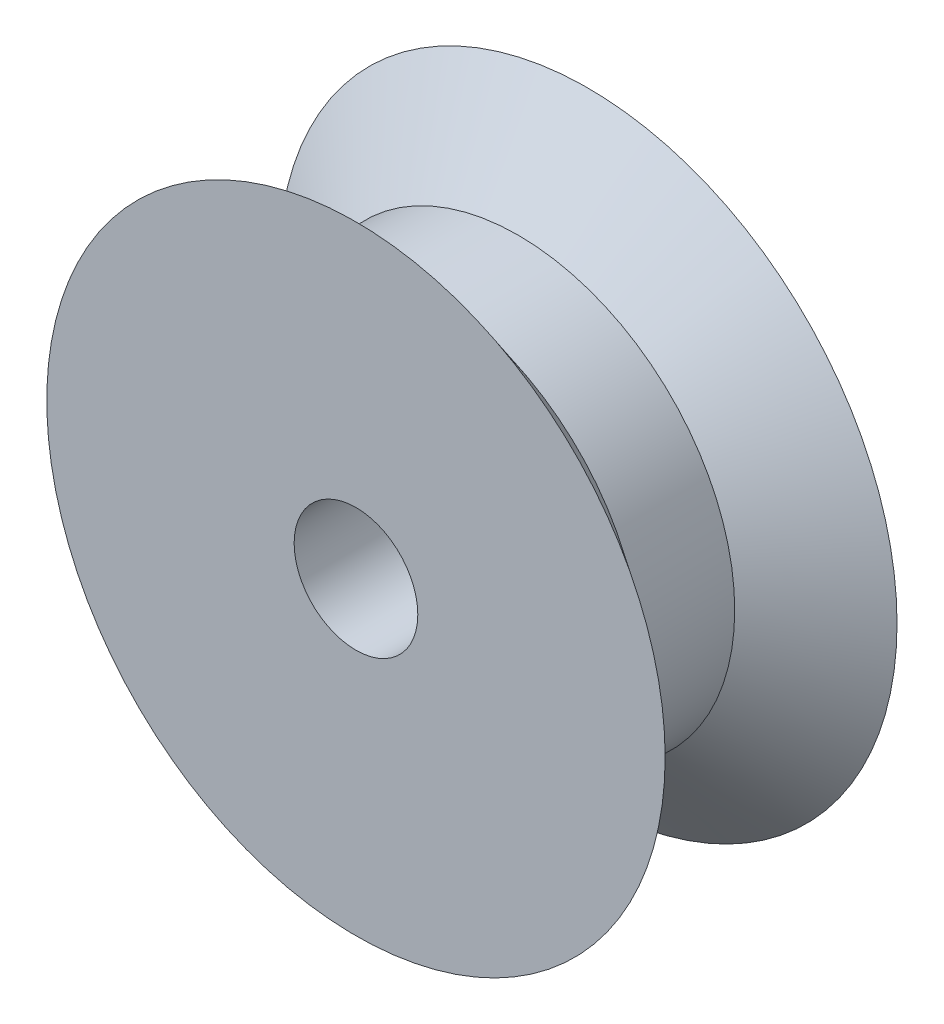
ISO-10303-21;
HEADER;
FILE_DESCRIPTION(('STEP AP214'),'2;1');
FILE_NAME('part.step','',(''),(''),'','','');
FILE_SCHEMA(('AUTOMOTIVE_DESIGN { 1 0 10303 214 1 1 1 1 }'));
ENDSEC;
DATA;
#1=APPLICATION_CONTEXT('core data for automotive mechanical design processes');
#2=APPLICATION_PROTOCOL_DEFINITION('international standard','automotive_design',2000,#1);
#3=PRODUCT_CONTEXT('',#1,'mechanical');
#4=PRODUCT('Part','Part','',(#3));
#5=PRODUCT_RELATED_PRODUCT_CATEGORY('part','',(#4));
#6=PRODUCT_DEFINITION_FORMATION('','',#4);
#7=PRODUCT_DEFINITION_CONTEXT('part definition',#1,'design');
#8=PRODUCT_DEFINITION('design','',#6,#7);
#9=PRODUCT_DEFINITION_SHAPE('','',#8);
#10=(LENGTH_UNIT() NAMED_UNIT(*) SI_UNIT(.MILLI.,.METRE.));
#11=(NAMED_UNIT(*) PLANE_ANGLE_UNIT() SI_UNIT($,.RADIAN.));
#12=(NAMED_UNIT(*) SI_UNIT($,.STERADIAN.) SOLID_ANGLE_UNIT());
#13=UNCERTAINTY_MEASURE_WITH_UNIT(LENGTH_MEASURE(1.E-05),#10,'distance_accuracy_value','');
#14=(GEOMETRIC_REPRESENTATION_CONTEXT(3) GLOBAL_UNCERTAINTY_ASSIGNED_CONTEXT((#13)) GLOBAL_UNIT_ASSIGNED_CONTEXT((#10,
#11,#12)) REPRESENTATION_CONTEXT('',''));
#15=CARTESIAN_POINT('',(0.,0.,0.));
#16=DIRECTION('',(0.,0.,1.));
#17=DIRECTION('',(1.,0.,0.));
#18=AXIS2_PLACEMENT_3D('',#15,#16,#17);
#19=CARTESIAN_POINT('',(0.,0.,0.));
#20=DIRECTION('',(0.,0.,1.));
#21=DIRECTION('',(1.,0.,0.));
#22=AXIS2_PLACEMENT_3D('',#19,#20,#21);
#23=PLANE('',#22);
#24=CARTESIAN_POINT('',(0.,0.,0.));
#25=DIRECTION('',(0.,0.,1.));
#26=DIRECTION('',(1.,0.,0.));
#27=AXIS2_PLACEMENT_3D('',#24,#25,#26);
#28=CIRCLE('',#27,25.4);
#29=CARTESIAN_POINT('',(25.4,0.,0.));
#30=VERTEX_POINT('',#29);
#31=EDGE_CURVE('E52',#30,#30,#28,.T.);
#32=ORIENTED_EDGE('',*,*,#31,.F.);
#33=EDGE_LOOP('',(#32));
#34=FACE_BOUND('',#33,.T.);
#35=CARTESIAN_POINT('',(0.,0.,0.));
#36=DIRECTION('',(0.,0.,1.));
#37=DIRECTION('',(1.,0.,0.));
#38=AXIS2_PLACEMENT_3D('',#35,#36,#37);
#39=CIRCLE('',#38,12.7);
#40=CARTESIAN_POINT('',(12.7,0.,0.));
#41=VERTEX_POINT('',#40);
#42=EDGE_CURVE('E10',#41,#41,#39,.F.);
#43=ORIENTED_EDGE('',*,*,#42,.F.);
#44=EDGE_LOOP('',(#43));
#45=FACE_BOUND('',#44,.T.);
#46=ADVANCED_FACE('F30',(#34,#45),#23,.F.);
#47=CARTESIAN_POINT('',(0.,0.,19.05));
#48=DIRECTION('',(0.,0.,1.));
#49=DIRECTION('',(1.,0.,0.));
#50=AXIS2_PLACEMENT_3D('',#47,#48,#49);
#51=PLANE('',#50);
#52=CARTESIAN_POINT('',(0.,0.,19.05));
#53=DIRECTION('',(0.,0.,1.));
#54=DIRECTION('',(1.,0.,0.));
#55=AXIS2_PLACEMENT_3D('',#52,#53,#54);
#56=CIRCLE('',#55,25.4);
#57=CARTESIAN_POINT('',(25.4,0.,19.05));
#58=VERTEX_POINT('',#57);
#59=EDGE_CURVE('E40',#58,#58,#56,.T.);
#60=ORIENTED_EDGE('',*,*,#59,.T.);
#61=EDGE_LOOP('',(#60));
#62=FACE_BOUND('',#61,.T.);
#63=CARTESIAN_POINT('',(0.,0.,19.05));
#64=DIRECTION('',(0.,0.,1.));
#65=DIRECTION('',(1.,0.,0.));
#66=AXIS2_PLACEMENT_3D('',#63,#64,#65);
#67=CIRCLE('',#66,5.08);
#68=CARTESIAN_POINT('',(5.08,0.,19.05));
#69=VERTEX_POINT('',#68);
#70=EDGE_CURVE('E36',#69,#69,#67,.T.);
#71=ORIENTED_EDGE('',*,*,#70,.F.);
#72=EDGE_LOOP('',(#71));
#73=FACE_BOUND('',#72,.T.);
#74=ADVANCED_FACE('F102',(#62,#73),#51,.T.);
#75=CARTESIAN_POINT('',(0.,0.,19.05));
#76=DIRECTION('',(0.,0.,-1.));
#77=DIRECTION('',(-1.,0.,0.));
#78=AXIS2_PLACEMENT_3D('',#75,#76,#77);
#79=CYLINDRICAL_SURFACE('',#78,5.08);
#80=CARTESIAN_POINT('',(5.08000000000001,0.,-4.445));
#81=CARTESIAN_POINT('',(5.07999881354918,0.0701684217403723,-4.44499803087503));
#82=CARTESIAN_POINT('',(5.07853169484948,0.140358840296713,-4.43916515367819));
#83=CARTESIAN_POINT('',(5.07282123042642,0.278728020792384,-4.41602270522674));
#84=CARTESIAN_POINT('',(5.0685763112224,0.346905619683892,-4.39870662925795));
#85=CARTESIAN_POINT('',(5.05778030294461,0.479231005114582,-4.35318809873543));
#86=CARTESIAN_POINT('',(5.051231984063,0.54338352370407,-4.32499871708773));
#87=CARTESIAN_POINT('',(5.03652657757096,0.666049071679081,-4.25857975642871));
#88=CARTESIAN_POINT('',(5.02836943569763,0.724561910748616,-4.22034983875263));
#89=CARTESIAN_POINT('',(5.01114410174392,0.835492298448112,-4.1341033314261));
#90=CARTESIAN_POINT('',(5.00206185385758,0.887777150918374,-4.08591886653456));
#91=CARTESIAN_POINT('',(4.98410331699508,0.983614091698797,-3.98149046651045));
#92=CARTESIAN_POINT('',(4.97522705137468,1.02716519395027,-3.92524562257197));
#93=CARTESIAN_POINT('',(4.95854376759088,1.10492247290318,-3.80526270802897));
#94=CARTESIAN_POINT('',(4.95075459318446,1.13898020948347,-3.74142573124719));
#95=CARTESIAN_POINT('',(4.93733238941016,1.19582938257278,-3.60870634479592));
#96=CARTESIAN_POINT('',(4.93169901536295,1.21862262027197,-3.53982474378419));
#97=CARTESIAN_POINT('',(4.92337070287527,1.25184309516097,-3.40043050485524));
#98=CARTESIAN_POINT('',(4.92061915777194,1.26250892052223,-3.32997818801117));
#99=CARTESIAN_POINT('',(4.91819660281954,1.27191496955745,-3.18823461156816));
#100=CARTESIAN_POINT('',(4.91852509179852,1.27065713340589,-3.11694349034184));
#101=CARTESIAN_POINT('',(4.92217460653804,1.25644192419459,-2.97737461610967));
#102=CARTESIAN_POINT('',(4.92542290674925,1.24376886136131,-2.90906570715955));
#103=CARTESIAN_POINT('',(4.93443014192756,1.20753647824463,-2.77557564356177));
#104=CARTESIAN_POINT('',(4.9401892557519,1.18397638241878,-2.71039471210213));
#105=CARTESIAN_POINT('',(4.95363596438878,1.12639642465346,-2.58424847957325));
#106=CARTESIAN_POINT('',(4.9613424392411,1.0922733782572,-2.52333237455151));
#107=CARTESIAN_POINT('',(4.97780488516607,1.01460831369266,-2.40798882573921));
#108=CARTESIAN_POINT('',(4.98656103976743,0.971064647324818,-2.35356251996972));
#109=CARTESIAN_POINT('',(5.00444245523681,0.874321699563431,-2.25111427204541));
#110=CARTESIAN_POINT('',(5.01357112158016,0.820882498580428,-2.20331919841472));
#111=CARTESIAN_POINT('',(5.03094384190039,0.706638090153133,-2.11732601471389));
#112=CARTESIAN_POINT('',(5.03918786885172,0.645832657792726,-2.07912819779018));
#113=CARTESIAN_POINT('',(5.05390346506408,0.518258119083578,-2.01333050366335));
#114=CARTESIAN_POINT('',(5.06036884908141,0.451469246249968,-1.98576747858458));
#115=CARTESIAN_POINT('',(5.07075369719401,0.314008353560974,-1.94232334783256));
#116=CARTESIAN_POINT('',(5.07467364827258,0.243337079280743,-1.92644000756598));
#117=CARTESIAN_POINT('',(5.07945389383097,0.102057174930222,-1.90715259449352));
#118=CARTESIAN_POINT('',(5.08038991970343,0.0314932229233506,-1.90343957125624));
#119=CARTESIAN_POINT('',(5.07931254742902,-0.10924783399861,-1.90775082174031));
#120=CARTESIAN_POINT('',(5.07729941478097,-0.179424973165757,-1.91577403890327));
#121=CARTESIAN_POINT('',(5.07059845354496,-0.316326747564097,-1.9430753691047));
#122=CARTESIAN_POINT('',(5.0659507027732,-0.383087134060212,-1.96218493641052));
#123=CARTESIAN_POINT('',(5.05450438283567,-0.51245117427646,-2.01092399781075));
#124=CARTESIAN_POINT('',(5.04770559646509,-0.575054407447631,-2.04055455431848));
#125=CARTESIAN_POINT('',(5.03253000710943,-0.69555625381727,-2.1100932557806));
#126=CARTESIAN_POINT('',(5.02412734370669,-0.75335167408767,-2.15017444182926));
#127=CARTESIAN_POINT('',(5.00671684445348,-0.861505866217948,-2.23925545611477));
#128=CARTESIAN_POINT('',(4.9977089043311,-0.91186335193048,-2.28825682354231));
#129=CARTESIAN_POINT('',(4.97983050226786,-1.00498534763491,-2.39522166018165));
#130=CARTESIAN_POINT('',(4.97096884211898,-1.04753314125332,-2.45337558854205));
#131=CARTESIAN_POINT('',(4.95463303692729,-1.12226577596408,-2.57618029718097));
#132=CARTESIAN_POINT('',(4.94715883030082,-1.15445107705372,-2.64083078890592));
#133=CARTESIAN_POINT('',(4.93452653542017,-1.20730553611587,-2.77444684497641));
#134=CARTESIAN_POINT('',(4.92935476147147,-1.22804292250044,-2.84338405866459));
#135=CARTESIAN_POINT('',(4.92189976663022,-1.25759265876087,-2.98391549341278));
#136=CARTESIAN_POINT('',(4.91961591402879,-1.2664076165986,-3.05550912987418));
#137=CARTESIAN_POINT('',(4.91824349686017,-1.27172600648278,-3.19711580019741));
#138=CARTESIAN_POINT('',(4.91906503043263,-1.2685758201205,-3.26711516173894));
#139=CARTESIAN_POINT('',(4.92360296293307,-1.25084609563823,-3.40555062573889));
#140=CARTESIAN_POINT('',(4.92731930368439,-1.23626678720813,-3.47398675958489));
#141=CARTESIAN_POINT('',(4.93717800711372,-1.19628185046157,-3.60697649534205));
#142=CARTESIAN_POINT('',(4.94330579566742,-1.17094118929605,-3.67155078510338));
#143=CARTESIAN_POINT('',(4.95729899847022,-1.11020429351896,-3.79557735736426));
#144=CARTESIAN_POINT('',(4.96516465368921,-1.07480666422895,-3.85502892796492));
#145=CARTESIAN_POINT('',(4.98200370343107,-0.993874693846109,-3.96879625255505));
#146=CARTESIAN_POINT('',(4.99100064224221,-0.948100011265709,-4.02293757549895));
#147=CARTESIAN_POINT('',(5.00894796401855,-0.848181667607309,-4.12288316459345));
#148=CARTESIAN_POINT('',(5.01789833542244,-0.794036022001103,-4.16868544816231));
#149=CARTESIAN_POINT('',(5.03493748448355,-0.677729223408193,-4.2514615745847));
#150=CARTESIAN_POINT('',(5.04300772249768,-0.615440664227874,-4.28826050624194));
#151=CARTESIAN_POINT('',(5.05718169812267,-0.48536526371887,-4.35080618528965));
#152=CARTESIAN_POINT('',(5.06328684402482,-0.417582403709773,-4.37656085201576));
#153=CARTESIAN_POINT('',(5.07194023765492,-0.291600681079473,-4.41246414967911));
#154=CARTESIAN_POINT('',(5.07494188677945,-0.234001878035498,-4.42463871911857));
#155=CARTESIAN_POINT('',(5.07897219096383,-0.117607140567386,-4.44090716559991));
#156=CARTESIAN_POINT('',(5.08000099441758,-0.0588112965187484,-4.44500165041182));
#157=CARTESIAN_POINT('',(5.08000000000001,0.,-4.445));
#158=B_SPLINE_CURVE_WITH_KNOTS('',3,(#80,#81,#82,#83,#84,#85,#86,#87,#88,#89,#90,#91,#92,#93,
#94,#95,#96,#97,#98,#99,#100,#101,#102,#103,#104,#105,#106,#107,#108,#109,#110,#111,#112,#113,
#114,#115,#116,#117,#118,#119,#120,#121,#122,#123,#124,#125,#126,#127,#128,#129,#130,#131,#132,
#133,#134,#135,#136,#137,#138,#139,#140,#141,#142,#143,#144,#145,#146,#147,#148,#149,#150,#151,
#152,#153,#154,#155,#156,#157),.UNSPECIFIED.,.T.,.F.,(4,2,2,2,2,2,2,2,2,2,2,2,2,2,2,2,2,2,2,2,2,
2,2,2,2,2,2,2,2,2,2,2,2,2,2,2,2,2,4),(0.,0.2102897432262,0.420698707973435,0.63085548393557,
0.841019349343365,1.05506888670111,1.26914257711119,1.48639654922116,1.70361577123399,
1.91648329850851,2.12931618935417,2.33699047465942,2.54467955601246,2.75446513599884,
2.96428744907951,3.18009270820436,3.39590455825983,3.61245767227717,3.82896934389718,
4.03994034910387,4.25089236275456,4.45871832421885,4.66656527799539,4.87810037471998,
5.08967200680123,5.3064368445979,5.52319205874583,5.73864108906551,5.95404298353705,
6.16325734070825,6.37246749342776,6.58043219140332,6.7884257435591,7.00184508027057,
7.21531509072287,7.43265117056318,7.64983114702076,7.8260976569102,8.00235090783107),.UNSPECIFIED.);
#159=CARTESIAN_POINT('',(5.08000000000001,0.,-4.445));
#160=VERTEX_POINT('',#159);
#161=EDGE_CURVE('E61',#160,#160,#158,.T.);
#162=ORIENTED_EDGE('',*,*,#161,.T.);
#163=EDGE_LOOP('',(#162));
#164=FACE_BOUND('',#163,.T.);
#165=ORIENTED_EDGE('',*,*,#70,.T.);
#166=EDGE_LOOP('',(#165));
#167=FACE_BOUND('',#166,.T.);
#168=CARTESIAN_POINT('',(0.,0.,-6.35));
#169=DIRECTION('',(0.,0.,-1.));
#170=DIRECTION('',(-1.,0.,0.));
#171=AXIS2_PLACEMENT_3D('',#168,#169,#170);
#172=CIRCLE('',#171,5.08);
#173=CARTESIAN_POINT('',(-5.08,0.,-6.35));
#174=VERTEX_POINT('',#173);
#175=EDGE_CURVE('E58',#174,#174,#172,.T.);
#176=ORIENTED_EDGE('',*,*,#175,.T.);
#177=EDGE_LOOP('',(#176));
#178=FACE_BOUND('',#177,.T.);
#179=ADVANCED_FACE('F99',(#164,#167,#178),#79,.F.);
#180=CARTESIAN_POINT('',(0.,0.,13.335));
#181=DIRECTION('',(0.,0.,1.));
#182=DIRECTION('',(1.,0.,0.));
#183=AXIS2_PLACEMENT_3D('',#180,#181,#182);
#184=CONICAL_SURFACE('',#183,17.78,0.927295218001613);
#185=ORIENTED_EDGE('',*,*,#59,.F.);
#186=EDGE_LOOP('',(#185));
#187=FACE_BOUND('',#186,.T.);
#188=CARTESIAN_POINT('',(0.,0.,13.335));
#189=DIRECTION('',(0.,0.,1.));
#190=DIRECTION('',(1.,0.,0.));
#191=AXIS2_PLACEMENT_3D('',#188,#189,#190);
#192=CIRCLE('',#191,17.78);
#193=CARTESIAN_POINT('',(17.78,0.,13.335));
#194=VERTEX_POINT('',#193);
#195=EDGE_CURVE('E44',#194,#194,#192,.T.);
#196=ORIENTED_EDGE('',*,*,#195,.T.);
#197=EDGE_LOOP('',(#196));
#198=FACE_BOUND('',#197,.T.);
#199=ADVANCED_FACE('F95',(#187,#198),#184,.T.);
#200=CARTESIAN_POINT('',(0.,0.,21.061205324429));
#201=DIRECTION('',(0.,0.,1.));
#202=DIRECTION('',(1.,0.,0.));
#203=AXIS2_PLACEMENT_3D('',#200,#201,#202);
#204=CYLINDRICAL_SURFACE('',#203,17.78);
#205=ORIENTED_EDGE('',*,*,#195,.F.);
#206=EDGE_LOOP('',(#205));
#207=FACE_BOUND('',#206,.T.);
#208=CARTESIAN_POINT('',(0.,0.,5.71500000000001));
#209=DIRECTION('',(0.,0.,1.));
#210=DIRECTION('',(1.,0.,0.));
#211=AXIS2_PLACEMENT_3D('',#208,#209,#210);
#212=CIRCLE('',#211,17.78);
#213=CARTESIAN_POINT('',(17.78,0.,5.71500000000001));
#214=VERTEX_POINT('',#213);
#215=EDGE_CURVE('E49',#214,#214,#212,.T.);
#216=ORIENTED_EDGE('',*,*,#215,.T.);
#217=EDGE_LOOP('',(#216));
#218=FACE_BOUND('',#217,.T.);
#219=ADVANCED_FACE('F91',(#207,#218),#204,.T.);
#220=CARTESIAN_POINT('',(0.,0.,5.71500000000001));
#221=DIRECTION('',(0.,0.,-1.));
#222=DIRECTION('',(-1.,0.,0.));
#223=AXIS2_PLACEMENT_3D('',#220,#221,#222);
#224=CONICAL_SURFACE('',#223,17.78,0.927295218001613);
#225=ORIENTED_EDGE('',*,*,#31,.T.);
#226=EDGE_LOOP('',(#225));
#227=FACE_BOUND('',#226,.T.);
#228=ORIENTED_EDGE('',*,*,#215,.F.);
#229=EDGE_LOOP('',(#228));
#230=FACE_BOUND('',#229,.T.);
#231=ADVANCED_FACE('F84',(#227,#230),#224,.T.);
#232=CARTESIAN_POINT('',(0.,0.,-6.35));
#233=DIRECTION('',(0.,0.,-1.));
#234=DIRECTION('',(-1.,0.,0.));
#235=AXIS2_PLACEMENT_3D('',#232,#233,#234);
#236=PLANE('',#235);
#237=CARTESIAN_POINT('',(0.,0.,-6.35));
#238=DIRECTION('',(0.,0.,-1.));
#239=DIRECTION('',(-1.,0.,0.));
#240=AXIS2_PLACEMENT_3D('',#237,#238,#239);
#241=CIRCLE('',#240,12.7);
#242=CARTESIAN_POINT('',(-12.7,0.,-6.35));
#243=VERTEX_POINT('',#242);
#244=EDGE_CURVE('E55',#243,#243,#241,.T.);
#245=ORIENTED_EDGE('',*,*,#244,.T.);
#246=EDGE_LOOP('',(#245));
#247=FACE_BOUND('',#246,.T.);
#248=ORIENTED_EDGE('',*,*,#175,.F.);
#249=EDGE_LOOP('',(#248));
#250=FACE_BOUND('',#249,.T.);
#251=ADVANCED_FACE('F80',(#247,#250),#236,.T.);
#252=CARTESIAN_POINT('',(0.,0.,-6.35));
#253=DIRECTION('',(0.,0.,1.));
#254=DIRECTION('',(1.,0.,0.));
#255=AXIS2_PLACEMENT_3D('',#252,#253,#254);
#256=CYLINDRICAL_SURFACE('',#255,12.7);
#257=CARTESIAN_POINT('',(12.7,0.,-4.445));
#258=CARTESIAN_POINT('',(12.6999991811138,0.0711458493152778,-4.44499691910652));
#259=CARTESIAN_POINT('',(12.6993958050718,0.142338736363072,-4.43900144850152));
#260=CARTESIAN_POINT('',(12.6970468384532,0.282750766090983,-4.41517484973116));
#261=CARTESIAN_POINT('',(12.6952999895121,0.351967646544412,-4.39733068204877));
#262=CARTESIAN_POINT('',(12.690861264951,0.486374027825837,-4.35033135444075));
#263=CARTESIAN_POINT('',(12.688169960169,0.551565933460936,-4.32118302574154));
#264=CARTESIAN_POINT('',(12.6821432589077,0.676117724419717,-4.25241604692681));
#265=CARTESIAN_POINT('',(12.6788079905443,0.735478766249428,-4.21279947887982));
#266=CARTESIAN_POINT('',(12.6718535531348,0.846911629356085,-4.12406757396891));
#267=CARTESIAN_POINT('',(12.6682335099881,0.898959523940314,-4.07492225475942));
#268=CARTESIAN_POINT('',(12.6611247527095,0.99408300221735,-3.96859184148595));
#269=CARTESIAN_POINT('',(12.6576360446584,1.03715817089497,-3.91140637574617));
#270=CARTESIAN_POINT('',(12.6511760127204,1.11319814246339,-3.7904692647618));
#271=CARTESIAN_POINT('',(12.6482058022285,1.1461413011277,-3.72670394599953));
#272=CARTESIAN_POINT('',(12.6431298768409,1.20084390862331,-3.59451200590068));
#273=CARTESIAN_POINT('',(12.6410241405862,1.22260363377094,-3.52608549977838));
#274=CARTESIAN_POINT('',(12.6379234677268,1.25425078283441,-3.38675751290017));
#275=CARTESIAN_POINT('',(12.6369248200558,1.26417787931482,-3.3158651273977));
#276=CARTESIAN_POINT('',(12.6361398668687,1.27200061212191,-3.17341394348736));
#277=CARTESIAN_POINT('',(12.6363535294871,1.26989656468592,-3.10185516264498));
#278=CARTESIAN_POINT('',(12.6379656676165,1.2537494359209,-2.96037595668949));
#279=CARTESIAN_POINT('',(12.6393598443013,1.23974967203818,-2.89045053185256));
#280=CARTESIAN_POINT('',(12.6431692054502,1.20027591307124,-2.75394678673461));
#281=CARTESIAN_POINT('',(12.6455844037068,1.1748017629848,-2.68736851168221));
#282=CARTESIAN_POINT('',(12.6511686200413,1.11305453522951,-2.55931214413041));
#283=CARTESIAN_POINT('',(12.6543389776336,1.07676223905437,-2.49784337934857));
#284=CARTESIAN_POINT('',(12.6610751570076,0.994422734738599,-2.38185297706191));
#285=CARTESIAN_POINT('',(12.6646409903624,0.948375241087362,-2.32733154296316));
#286=CARTESIAN_POINT('',(12.671785493475,0.847590522763328,-2.22653174963393));
#287=CARTESIAN_POINT('',(12.6753641505291,0.792815888141232,-2.18029078561138));
#288=CARTESIAN_POINT('',(12.6821162292972,0.676261641806133,-2.09765438620381));
#289=CARTESIAN_POINT('',(12.6852896505569,0.614482022239493,-2.06125896185727));
#290=CARTESIAN_POINT('',(12.6908747409721,0.485645594229303,-1.99934827420598));
#291=CARTESIAN_POINT('',(12.6932862772676,0.418587867915177,-1.97383490828106));
#292=CARTESIAN_POINT('',(12.6970745225059,0.281110966009013,-1.93443997577607));
#293=CARTESIAN_POINT('',(12.6984512623947,0.210691891006282,-1.92055806135191));
#294=CARTESIAN_POINT('',(12.7000108161875,0.0688150758467175,-1.90486752917685));
#295=CARTESIAN_POINT('',(12.7001987330002,-0.00263690367397513,-1.90300730871933));
#296=CARTESIAN_POINT('',(12.6993731503113,-0.144835617510939,-1.91127743607193));
#297=CARTESIAN_POINT('',(12.6983596670407,-0.215582361341997,-1.92140762189041));
#298=CARTESIAN_POINT('',(12.6952484415478,-0.354213422680037,-1.9533281931854));
#299=CARTESIAN_POINT('',(12.6931529463591,-0.422103358194465,-1.97509441718707));
#300=CARTESIAN_POINT('',(12.6881127855297,-0.553268288157403,-2.02964437102733));
#301=CARTESIAN_POINT('',(12.6851681008507,-0.616543179099539,-2.06242834788003));
#302=CARTESIAN_POINT('',(12.6787462366964,-0.736915188818621,-2.13821116510317));
#303=CARTESIAN_POINT('',(12.6752673037637,-0.793990867881125,-2.18124390893579));
#304=CARTESIAN_POINT('',(12.6681729474429,-0.900127261606086,-2.27625410603098));
#305=CARTESIAN_POINT('',(12.6645575206307,-0.949187775038455,-2.3282317837993));
#306=CARTESIAN_POINT('',(12.6575823065876,-1.03808035955668,-2.43988154981693));
#307=CARTESIAN_POINT('',(12.654223486765,-1.07787856392302,-2.49958067080913));
#308=CARTESIAN_POINT('',(12.6481564722533,-1.14688398860466,-2.62484534738629));
#309=CARTESIAN_POINT('',(12.6454482686673,-1.17609135374843,-2.69041082273426));
#310=CARTESIAN_POINT('',(12.6409951349524,-1.22302931502928,-2.82543089912156));
#311=CARTESIAN_POINT('',(12.6392485143123,-1.24078006201106,-2.89487843691572));
#312=CARTESIAN_POINT('',(12.6369110390925,-1.26436628905442,-3.03578666141018));
#313=CARTESIAN_POINT('',(12.6363201513654,-1.27020211084739,-3.10724729031351));
#314=CARTESIAN_POINT('',(12.636361736466,-1.2697880858585,-3.24981657421301));
#315=CARTESIAN_POINT('',(12.636988824105,-1.26359143978325,-3.32092539126117));
#316=CARTESIAN_POINT('',(12.6393842193972,-1.23939992526384,-3.46108644480373));
#317=CARTESIAN_POINT('',(12.6411525283342,-1.22140504354794,-3.53013867898459));
#318=CARTESIAN_POINT('',(12.6456296269425,-1.17414254159783,-3.66422603329078));
#319=CARTESIAN_POINT('',(12.6483382864626,-1.14487648131296,-3.72926170786975));
#320=CARTESIAN_POINT('',(12.6543911483599,-1.07590787473703,-3.85350625242221));
#321=CARTESIAN_POINT('',(12.6577353471781,-1.03620538688838,-3.9127151550222));
#322=CARTESIAN_POINT('',(12.6647001875632,-0.947291166482371,-4.02389806657936));
#323=CARTESIAN_POINT('',(12.6683219420297,-0.898039795090641,-4.0758403069862));
#324=CARTESIAN_POINT('',(12.6754236550555,-0.791504258015889,-4.17074633552857));
#325=CARTESIAN_POINT('',(12.6789035794418,-0.734218171017486,-4.21370797002361));
#326=CARTESIAN_POINT('',(12.6853386382784,-0.613081621384837,-4.28951828639537));
#327=CARTESIAN_POINT('',(12.6882924291405,-0.54921499167039,-4.32234122950038));
#328=CARTESIAN_POINT('',(12.6933277914737,-0.416888014457699,-4.37675327698631));
#329=CARTESIAN_POINT('',(12.6954103458526,-0.348432945278524,-4.39835504751101));
#330=CARTESIAN_POINT('',(12.6979453149264,-0.232991991985244,-4.4243251836977));
#331=CARTESIAN_POINT('',(12.6987122287863,-0.186744042112526,-4.43206764626018));
#332=CARTESIAN_POINT('',(12.699739839875,-0.0936708576379874,-4.44240605809844));
#333=CARTESIAN_POINT('',(12.7000005391915,-0.0468456254177284,-4.44500202859876));
#334=CARTESIAN_POINT('',(12.7,0.,-4.445));
#335=B_SPLINE_CURVE_WITH_KNOTS('',3,(#257,#258,#259,#260,#261,#262,#263,#264,#265,#266,#267,
#268,#269,#270,#271,#272,#273,#274,#275,#276,#277,#278,#279,#280,#281,#282,#283,#284,#285,#286,
#287,#288,#289,#290,#291,#292,#293,#294,#295,#296,#297,#298,#299,#300,#301,#302,#303,#304,#305,
#306,#307,#308,#309,#310,#311,#312,#313,#314,#315,#316,#317,#318,#319,#320,#321,#322,#323,#324,
#325,#326,#327,#328,#329,#330,#331,#332,#333,#334),.UNSPECIFIED.,.T.,.F.,(4,2,2,2,2,2,2,2,2,2,2,
2,2,2,2,2,2,2,2,2,2,2,2,2,2,2,2,2,2,2,2,2,2,2,2,2,2,2,4),(0.,0.213266485160962,
0.426768060401068,0.640140814879898,0.853471162730133,1.06748398215114,1.28150669810296,
1.49598348849722,1.7104549794198,1.924205346974,2.13795009614836,2.3509198275021,
2.56389243585275,2.77724566943576,2.99060514820529,3.20490512429182,3.4192053406431,
3.63354290680849,3.84787406287808,4.06128459531852,4.27469224459312,4.48765847823767,
4.70062948682823,4.91431504750847,5.12800597218992,5.3424663738292,5.55692384263725,
5.77100307053114,5.98507615834273,6.19820489203325,6.41133386547071,6.62443335210756,
6.8375316454448,7.0515342513312,7.26558811848937,7.48018101403328,7.69453115390025,
7.83495597385083,7.97538021467665),.UNSPECIFIED.);
#336=CARTESIAN_POINT('',(12.7,0.,-4.445));
#337=VERTEX_POINT('',#336);
#338=EDGE_CURVE('E68',#337,#337,#335,.T.);
#339=ORIENTED_EDGE('',*,*,#338,.F.);
#340=EDGE_LOOP('',(#339));
#341=FACE_BOUND('',#340,.T.);
#342=ORIENTED_EDGE('',*,*,#244,.F.);
#343=EDGE_LOOP('',(#342));
#344=FACE_BOUND('',#343,.T.);
#345=ORIENTED_EDGE('',*,*,#42,.T.);
#346=EDGE_LOOP('',(#345));
#347=FACE_BOUND('',#346,.T.);
#348=ADVANCED_FACE('F78',(#341,#344,#347),#256,.T.);
#349=CARTESIAN_POINT('',(-25.401,0.,-3.175));
#350=DIRECTION('',(1.,0.,0.));
#351=DIRECTION('',(0.,0.,-1.));
#352=AXIS2_PLACEMENT_3D('',#349,#350,#351);
#353=CYLINDRICAL_SURFACE('',#352,1.27);
#354=ORIENTED_EDGE('',*,*,#161,.F.);
#355=EDGE_LOOP('',(#354));
#356=FACE_BOUND('',#355,.T.);
#357=ORIENTED_EDGE('',*,*,#338,.T.);
#358=EDGE_LOOP('',(#357));
#359=FACE_BOUND('',#358,.T.);
#360=ADVANCED_FACE('F72',(#356,#359),#353,.F.);
#361=CLOSED_SHELL('',(#46,#74,#179,#199,#219,#231,#251,#348,#360));
#362=MANIFOLD_SOLID_BREP('B2',#361);
#363=ADVANCED_BREP_SHAPE_REPRESENTATION('',(#18,#362),#14);
#364=SHAPE_DEFINITION_REPRESENTATION(#9,#363);
ENDSEC;
END-ISO-10303-21;
